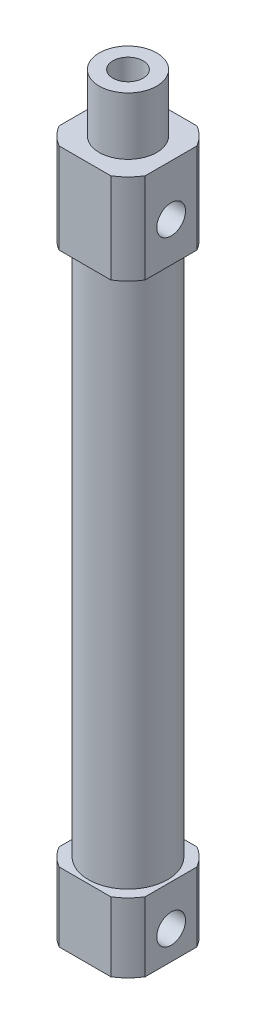
ISO-10303-21;
HEADER;
FILE_DESCRIPTION(('STEP AP214'),'2;1');
FILE_NAME('part.step','',(''),(''),'','','');
FILE_SCHEMA(('AUTOMOTIVE_DESIGN { 1 0 10303 214 1 1 1 1 }'));
ENDSEC;
DATA;
#1=APPLICATION_CONTEXT('core data for automotive mechanical design processes');
#2=APPLICATION_PROTOCOL_DEFINITION('international standard','automotive_design',2000,#1);
#3=PRODUCT_CONTEXT('',#1,'mechanical');
#4=PRODUCT('Part','Part','',(#3));
#5=PRODUCT_RELATED_PRODUCT_CATEGORY('part','',(#4));
#6=PRODUCT_DEFINITION_FORMATION('','',#4);
#7=PRODUCT_DEFINITION_CONTEXT('part definition',#1,'design');
#8=PRODUCT_DEFINITION('design','',#6,#7);
#9=PRODUCT_DEFINITION_SHAPE('','',#8);
#10=(LENGTH_UNIT() NAMED_UNIT(*) SI_UNIT(.MILLI.,.METRE.));
#11=(NAMED_UNIT(*) PLANE_ANGLE_UNIT() SI_UNIT($,.RADIAN.));
#12=(NAMED_UNIT(*) SI_UNIT($,.STERADIAN.) SOLID_ANGLE_UNIT());
#13=UNCERTAINTY_MEASURE_WITH_UNIT(LENGTH_MEASURE(1.E-05),#10,'distance_accuracy_value','');
#14=(GEOMETRIC_REPRESENTATION_CONTEXT(3) GLOBAL_UNCERTAINTY_ASSIGNED_CONTEXT((#13)) GLOBAL_UNIT_ASSIGNED_CONTEXT((#10,
#11,#12)) REPRESENTATION_CONTEXT('',''));
#15=CARTESIAN_POINT('',(0.,0.,0.));
#16=DIRECTION('',(0.,0.,1.));
#17=DIRECTION('',(1.,0.,0.));
#18=AXIS2_PLACEMENT_3D('',#15,#16,#17);
#19=CARTESIAN_POINT('',(6.,9.64,6.));
#20=DIRECTION('',(-1.,0.,0.));
#21=DIRECTION('',(0.,0.,1.));
#22=AXIS2_PLACEMENT_3D('',#19,#20,#21);
#23=PLANE('',#22);
#24=CARTESIAN_POINT('',(6.,4.,0.));
#25=DIRECTION('',(1.,0.,0.));
#26=DIRECTION('',(0.,0.,-1.));
#27=AXIS2_PLACEMENT_3D('',#24,#25,#26);
#28=CIRCLE('',#27,2.);
#29=CARTESIAN_POINT('',(6.,4.,-2.));
#30=VERTEX_POINT('',#29);
#31=EDGE_CURVE('E345',#30,#30,#28,.T.);
#32=ORIENTED_EDGE('',*,*,#31,.F.);
#33=EDGE_LOOP('',(#32));
#34=FACE_BOUND('',#33,.T.);
#35=DIRECTION('',(0.,1.,0.));
#36=VECTOR('',#35,1.);
#37=CARTESIAN_POINT('',(6.,-5.51000000000004,3.60555127546399));
#38=LINE('',#37,#36);
#39=CARTESIAN_POINT('',(6.,0.,3.60555127546399));
#40=VERTEX_POINT('',#39);
#41=CARTESIAN_POINT('',(6.,9.64,3.60555127546399));
#42=VERTEX_POINT('',#41);
#43=EDGE_CURVE('E280',#40,#42,#38,.T.);
#44=ORIENTED_EDGE('',*,*,#43,.F.);
#45=DIRECTION('',(0.,0.,-1.));
#46=VECTOR('',#45,1.);
#47=CARTESIAN_POINT('',(6.,0.,6.));
#48=LINE('',#47,#46);
#49=CARTESIAN_POINT('',(6.,0.,-3.60555127546399));
#50=VERTEX_POINT('',#49);
#51=EDGE_CURVE('E204',#40,#50,#48,.T.);
#52=ORIENTED_EDGE('',*,*,#51,.T.);
#53=DIRECTION('',(0.,1.,0.));
#54=VECTOR('',#53,1.);
#55=CARTESIAN_POINT('',(6.,-5.51000000000004,-3.60555127546399));
#56=LINE('',#55,#54);
#57=CARTESIAN_POINT('',(6.,9.64,-3.60555127546399));
#58=VERTEX_POINT('',#57);
#59=EDGE_CURVE('E286',#58,#50,#56,.F.);
#60=ORIENTED_EDGE('',*,*,#59,.F.);
#61=DIRECTION('',(0.,0.,-1.));
#62=VECTOR('',#61,1.);
#63=CARTESIAN_POINT('',(6.,9.64,6.));
#64=LINE('',#63,#62);
#65=EDGE_CURVE('E210',#42,#58,#64,.T.);
#66=ORIENTED_EDGE('',*,*,#65,.F.);
#67=EDGE_LOOP('',(#44,#52,#60,#66));
#68=FACE_BOUND('',#67,.T.);
#69=ADVANCED_FACE('F38',(#34,#68),#23,.F.);
#70=CARTESIAN_POINT('',(-6.,9.64,-6.));
#71=DIRECTION('',(0.,0.,1.));
#72=DIRECTION('',(1.,0.,0.));
#73=AXIS2_PLACEMENT_3D('',#70,#71,#72);
#74=PLANE('',#73);
#75=DIRECTION('',(0.,1.,0.));
#76=VECTOR('',#75,1.);
#77=CARTESIAN_POINT('',(3.60555127546399,-5.51000000000004,-6.));
#78=LINE('',#77,#76);
#79=CARTESIAN_POINT('',(3.60555127546399,0.,-6.));
#80=VERTEX_POINT('',#79);
#81=CARTESIAN_POINT('',(3.60555127546399,9.64,-6.));
#82=VERTEX_POINT('',#81);
#83=EDGE_CURVE('E284',#80,#82,#78,.T.);
#84=ORIENTED_EDGE('',*,*,#83,.F.);
#85=DIRECTION('',(-1.,0.,0.));
#86=VECTOR('',#85,1.);
#87=CARTESIAN_POINT('',(-6.,0.,-6.));
#88=LINE('',#87,#86);
#89=CARTESIAN_POINT('',(-3.60555127546399,0.,-6.));
#90=VERTEX_POINT('',#89);
#91=EDGE_CURVE('E224',#80,#90,#88,.T.);
#92=ORIENTED_EDGE('',*,*,#91,.T.);
#93=DIRECTION('',(0.,1.,0.));
#94=VECTOR('',#93,1.);
#95=CARTESIAN_POINT('',(-3.60555127546399,-5.51000000000004,-6.));
#96=LINE('',#95,#94);
#97=CARTESIAN_POINT('',(-3.60555127546399,9.64,-6.));
#98=VERTEX_POINT('',#97);
#99=EDGE_CURVE('E58',#98,#90,#96,.F.);
#100=ORIENTED_EDGE('',*,*,#99,.F.);
#101=DIRECTION('',(-1.,0.,0.));
#102=VECTOR('',#101,1.);
#103=CARTESIAN_POINT('',(-6.,9.64,-6.));
#104=LINE('',#103,#102);
#105=EDGE_CURVE('E213',#82,#98,#104,.T.);
#106=ORIENTED_EDGE('',*,*,#105,.F.);
#107=EDGE_LOOP('',(#84,#92,#100,#106));
#108=FACE_BOUND('',#107,.T.);
#109=ADVANCED_FACE('F321',(#108),#74,.F.);
#110=CARTESIAN_POINT('',(-6.,9.64,6.));
#111=DIRECTION('',(1.,0.,0.));
#112=DIRECTION('',(0.,0.,-1.));
#113=AXIS2_PLACEMENT_3D('',#110,#111,#112);
#114=PLANE('',#113);
#115=DIRECTION('',(0.,1.,0.));
#116=VECTOR('',#115,1.);
#117=CARTESIAN_POINT('',(-6.,-5.51000000000004,-3.60555127546399));
#118=LINE('',#117,#116);
#119=CARTESIAN_POINT('',(-6.,0.,-3.60555127546399));
#120=VERTEX_POINT('',#119);
#121=CARTESIAN_POINT('',(-6.,9.64,-3.60555127546399));
#122=VERTEX_POINT('',#121);
#123=EDGE_CURVE('E266',#120,#122,#118,.T.);
#124=ORIENTED_EDGE('',*,*,#123,.F.);
#125=DIRECTION('',(0.,0.,1.));
#126=VECTOR('',#125,1.);
#127=CARTESIAN_POINT('',(-6.,0.,6.));
#128=LINE('',#127,#126);
#129=CARTESIAN_POINT('',(-6.,0.,3.60555127546399));
#130=VERTEX_POINT('',#129);
#131=EDGE_CURVE('E227',#120,#130,#128,.T.);
#132=ORIENTED_EDGE('',*,*,#131,.T.);
#133=DIRECTION('',(0.,1.,0.));
#134=VECTOR('',#133,1.);
#135=CARTESIAN_POINT('',(-6.,-5.51000000000004,3.60555127546399));
#136=LINE('',#135,#134);
#137=CARTESIAN_POINT('',(-6.,9.64,3.60555127546399));
#138=VERTEX_POINT('',#137);
#139=EDGE_CURVE('E66',#138,#130,#136,.F.);
#140=ORIENTED_EDGE('',*,*,#139,.F.);
#141=DIRECTION('',(0.,0.,1.));
#142=VECTOR('',#141,1.);
#143=CARTESIAN_POINT('',(-6.,9.64,6.));
#144=LINE('',#143,#142);
#145=EDGE_CURVE('E217',#122,#138,#144,.T.);
#146=ORIENTED_EDGE('',*,*,#145,.F.);
#147=EDGE_LOOP('',(#124,#132,#140,#146));
#148=FACE_BOUND('',#147,.T.);
#149=ADVANCED_FACE('F312',(#148),#114,.F.);
#150=CARTESIAN_POINT('',(-6.,9.64,6.));
#151=DIRECTION('',(0.,0.,-1.));
#152=DIRECTION('',(-1.,0.,0.));
#153=AXIS2_PLACEMENT_3D('',#150,#151,#152);
#154=PLANE('',#153);
#155=DIRECTION('',(0.,1.,0.));
#156=VECTOR('',#155,1.);
#157=CARTESIAN_POINT('',(-3.60555127546399,-5.51000000000004,6.));
#158=LINE('',#157,#156);
#159=CARTESIAN_POINT('',(-3.60555127546399,0.,6.));
#160=VERTEX_POINT('',#159);
#161=CARTESIAN_POINT('',(-3.60555127546399,9.64,6.));
#162=VERTEX_POINT('',#161);
#163=EDGE_CURVE('E275',#160,#162,#158,.T.);
#164=ORIENTED_EDGE('',*,*,#163,.F.);
#165=DIRECTION('',(1.,0.,0.));
#166=VECTOR('',#165,1.);
#167=CARTESIAN_POINT('',(-6.,0.,6.));
#168=LINE('',#167,#166);
#169=CARTESIAN_POINT('',(3.60555127546399,0.,6.));
#170=VERTEX_POINT('',#169);
#171=EDGE_CURVE('E214',#160,#170,#168,.T.);
#172=ORIENTED_EDGE('',*,*,#171,.T.);
#173=DIRECTION('',(0.,1.,0.));
#174=VECTOR('',#173,1.);
#175=CARTESIAN_POINT('',(3.60555127546399,-5.51000000000004,6.));
#176=LINE('',#175,#174);
#177=CARTESIAN_POINT('',(3.60555127546399,9.64,6.));
#178=VERTEX_POINT('',#177);
#179=EDGE_CURVE('E278',#178,#170,#176,.F.);
#180=ORIENTED_EDGE('',*,*,#179,.F.);
#181=DIRECTION('',(1.,0.,0.));
#182=VECTOR('',#181,1.);
#183=CARTESIAN_POINT('',(-6.,9.64,6.));
#184=LINE('',#183,#182);
#185=EDGE_CURVE('E209',#162,#178,#184,.T.);
#186=ORIENTED_EDGE('',*,*,#185,.F.);
#187=EDGE_LOOP('',(#164,#172,#180,#186));
#188=FACE_BOUND('',#187,.T.);
#189=ADVANCED_FACE('F328',(#188),#154,.F.);
#190=CARTESIAN_POINT('',(0.,9.64,0.));
#191=DIRECTION('',(0.,-1.,0.));
#192=DIRECTION('',(0.,0.,-1.));
#193=AXIS2_PLACEMENT_3D('',#190,#191,#192);
#194=PLANE('',#193);
#195=CARTESIAN_POINT('',(0.,9.64,0.));
#196=DIRECTION('',(0.,1.,0.));
#197=DIRECTION('',(0.,0.,1.));
#198=AXIS2_PLACEMENT_3D('',#195,#196,#197);
#199=CIRCLE('',#198,5.5);
#200=CARTESIAN_POINT('',(0.,9.64,5.5));
#201=VERTEX_POINT('',#200);
#202=EDGE_CURVE('E205',#201,#201,#199,.T.);
#203=ORIENTED_EDGE('',*,*,#202,.F.);
#204=EDGE_LOOP('',(#203));
#205=FACE_BOUND('',#204,.T.);
#206=CARTESIAN_POINT('',(0.,9.64,0.));
#207=DIRECTION('',(0.,-1.,0.));
#208=DIRECTION('',(0.,0.,-1.));
#209=AXIS2_PLACEMENT_3D('',#206,#207,#208);
#210=CIRCLE('',#209,7.);
#211=EDGE_CURVE('E273',#82,#58,#210,.T.);
#212=ORIENTED_EDGE('',*,*,#211,.F.);
#213=ORIENTED_EDGE('',*,*,#105,.T.);
#214=EDGE_CURVE('E271',#122,#98,#210,.T.);
#215=ORIENTED_EDGE('',*,*,#214,.F.);
#216=ORIENTED_EDGE('',*,*,#145,.T.);
#217=EDGE_CURVE('E274',#162,#138,#210,.T.);
#218=ORIENTED_EDGE('',*,*,#217,.F.);
#219=ORIENTED_EDGE('',*,*,#185,.T.);
#220=EDGE_CURVE('E283',#42,#178,#210,.T.);
#221=ORIENTED_EDGE('',*,*,#220,.F.);
#222=ORIENTED_EDGE('',*,*,#65,.T.);
#223=EDGE_LOOP('',(#212,#213,#215,#216,#218,#219,#221,#222));
#224=FACE_BOUND('',#223,.T.);
#225=ADVANCED_FACE('F317',(#205,#224),#194,.F.);
#226=CARTESIAN_POINT('',(0.,0.,0.));
#227=DIRECTION('',(0.,-1.,0.));
#228=DIRECTION('',(0.,0.,-1.));
#229=AXIS2_PLACEMENT_3D('',#226,#227,#228);
#230=PLANE('',#229);
#231=ORIENTED_EDGE('',*,*,#91,.F.);
#232=CARTESIAN_POINT('',(0.,0.,0.));
#233=DIRECTION('',(0.,-1.,0.));
#234=DIRECTION('',(0.,0.,-1.));
#235=AXIS2_PLACEMENT_3D('',#232,#233,#234);
#236=CIRCLE('',#235,7.);
#237=EDGE_CURVE('E267',#80,#50,#236,.T.);
#238=ORIENTED_EDGE('',*,*,#237,.T.);
#239=ORIENTED_EDGE('',*,*,#51,.F.);
#240=EDGE_CURVE('E281',#40,#170,#236,.T.);
#241=ORIENTED_EDGE('',*,*,#240,.T.);
#242=ORIENTED_EDGE('',*,*,#171,.F.);
#243=EDGE_CURVE('E268',#160,#130,#236,.T.);
#244=ORIENTED_EDGE('',*,*,#243,.T.);
#245=ORIENTED_EDGE('',*,*,#131,.F.);
#246=EDGE_CURVE('E177',#120,#90,#236,.T.);
#247=ORIENTED_EDGE('',*,*,#246,.T.);
#248=EDGE_LOOP('',(#231,#238,#239,#241,#242,#244,#245,#247));
#249=FACE_BOUND('',#248,.T.);
#250=ADVANCED_FACE('F308',(#249),#230,.T.);
#251=CARTESIAN_POINT('',(6.,96.49,-6.));
#252=DIRECTION('',(0.,0.,1.));
#253=DIRECTION('',(1.,0.,0.));
#254=AXIS2_PLACEMENT_3D('',#251,#252,#253);
#255=PLANE('',#254);
#256=DIRECTION('',(0.,1.,0.));
#257=VECTOR('',#256,1.);
#258=CARTESIAN_POINT('',(3.60555127546399,-5.51000000000004,-6.));
#259=LINE('',#258,#257);
#260=CARTESIAN_POINT('',(3.60555127546399,83.94,-6.));
#261=VERTEX_POINT('',#260);
#262=CARTESIAN_POINT('',(3.60555127546399,96.49,-6.));
#263=VERTEX_POINT('',#262);
#264=EDGE_CURVE('E250',#261,#263,#259,.T.);
#265=ORIENTED_EDGE('',*,*,#264,.F.);
#266=DIRECTION('',(-1.,0.,0.));
#267=VECTOR('',#266,1.);
#268=CARTESIAN_POINT('',(6.,83.94,-6.));
#269=LINE('',#268,#267);
#270=CARTESIAN_POINT('',(-3.60555127546399,83.94,-6.));
#271=VERTEX_POINT('',#270);
#272=EDGE_CURVE('E191',#261,#271,#269,.T.);
#273=ORIENTED_EDGE('',*,*,#272,.T.);
#274=DIRECTION('',(0.,1.,0.));
#275=VECTOR('',#274,1.);
#276=CARTESIAN_POINT('',(-3.60555127546399,-5.51000000000004,-6.));
#277=LINE('',#276,#275);
#278=CARTESIAN_POINT('',(-3.60555127546399,96.49,-6.));
#279=VERTEX_POINT('',#278);
#280=EDGE_CURVE('E252',#279,#271,#277,.F.);
#281=ORIENTED_EDGE('',*,*,#280,.F.);
#282=DIRECTION('',(-1.,0.,0.));
#283=VECTOR('',#282,1.);
#284=CARTESIAN_POINT('',(6.,96.49,-6.));
#285=LINE('',#284,#283);
#286=EDGE_CURVE('E187',#263,#279,#285,.T.);
#287=ORIENTED_EDGE('',*,*,#286,.F.);
#288=EDGE_LOOP('',(#265,#273,#281,#287));
#289=FACE_BOUND('',#288,.T.);
#290=ADVANCED_FACE('F249',(#289),#255,.F.);
#291=CARTESIAN_POINT('',(-6.,96.49,-6.));
#292=DIRECTION('',(1.,0.,0.));
#293=DIRECTION('',(0.,0.,-1.));
#294=AXIS2_PLACEMENT_3D('',#291,#292,#293);
#295=PLANE('',#294);
#296=DIRECTION('',(0.,1.,0.));
#297=VECTOR('',#296,1.);
#298=CARTESIAN_POINT('',(-6.,-5.51000000000004,-3.60555127546399));
#299=LINE('',#298,#297);
#300=CARTESIAN_POINT('',(-6.,83.94,-3.60555127546399));
#301=VERTEX_POINT('',#300);
#302=CARTESIAN_POINT('',(-6.,96.49,-3.60555127546399));
#303=VERTEX_POINT('',#302);
#304=EDGE_CURVE('E256',#301,#303,#299,.T.);
#305=ORIENTED_EDGE('',*,*,#304,.F.);
#306=DIRECTION('',(0.,0.,1.));
#307=VECTOR('',#306,1.);
#308=CARTESIAN_POINT('',(-6.,83.94,-6.));
#309=LINE('',#308,#307);
#310=CARTESIAN_POINT('',(-6.,83.94,3.60555127546399));
#311=VERTEX_POINT('',#310);
#312=EDGE_CURVE('E194',#301,#311,#309,.T.);
#313=ORIENTED_EDGE('',*,*,#312,.T.);
#314=DIRECTION('',(0.,1.,0.));
#315=VECTOR('',#314,1.);
#316=CARTESIAN_POINT('',(-6.,-5.51000000000004,3.60555127546399));
#317=LINE('',#316,#315);
#318=CARTESIAN_POINT('',(-6.,96.49,3.60555127546399));
#319=VERTEX_POINT('',#318);
#320=EDGE_CURVE('E259',#319,#311,#317,.F.);
#321=ORIENTED_EDGE('',*,*,#320,.F.);
#322=DIRECTION('',(0.,0.,1.));
#323=VECTOR('',#322,1.);
#324=CARTESIAN_POINT('',(-6.,96.49,-6.));
#325=LINE('',#324,#323);
#326=EDGE_CURVE('E183',#303,#319,#325,.T.);
#327=ORIENTED_EDGE('',*,*,#326,.F.);
#328=EDGE_LOOP('',(#305,#313,#321,#327));
#329=FACE_BOUND('',#328,.T.);
#330=ADVANCED_FACE('F362',(#329),#295,.F.);
#331=CARTESIAN_POINT('',(-6.,96.49,6.));
#332=DIRECTION('',(0.,0.,-1.));
#333=DIRECTION('',(-1.,0.,0.));
#334=AXIS2_PLACEMENT_3D('',#331,#332,#333);
#335=PLANE('',#334);
#336=DIRECTION('',(0.,1.,0.));
#337=VECTOR('',#336,1.);
#338=CARTESIAN_POINT('',(-3.60555127546399,-5.51000000000004,6.));
#339=LINE('',#338,#337);
#340=CARTESIAN_POINT('',(-3.60555127546399,83.94,6.));
#341=VERTEX_POINT('',#340);
#342=CARTESIAN_POINT('',(-3.60555127546399,96.49,6.));
#343=VERTEX_POINT('',#342);
#344=EDGE_CURVE('E165',#341,#343,#339,.T.);
#345=ORIENTED_EDGE('',*,*,#344,.F.);
#346=DIRECTION('',(1.,0.,0.));
#347=VECTOR('',#346,1.);
#348=CARTESIAN_POINT('',(-6.,83.94,6.));
#349=LINE('',#348,#347);
#350=CARTESIAN_POINT('',(3.60555127546399,83.94,6.));
#351=VERTEX_POINT('',#350);
#352=EDGE_CURVE('E176',#341,#351,#349,.T.);
#353=ORIENTED_EDGE('',*,*,#352,.T.);
#354=DIRECTION('',(0.,1.,0.));
#355=VECTOR('',#354,1.);
#356=CARTESIAN_POINT('',(3.60555127546399,-5.51000000000004,6.));
#357=LINE('',#356,#355);
#358=CARTESIAN_POINT('',(3.60555127546399,96.49,6.));
#359=VERTEX_POINT('',#358);
#360=EDGE_CURVE('E157',#359,#351,#357,.F.);
#361=ORIENTED_EDGE('',*,*,#360,.F.);
#362=DIRECTION('',(1.,0.,0.));
#363=VECTOR('',#362,1.);
#364=CARTESIAN_POINT('',(-6.,96.49,6.));
#365=LINE('',#364,#363);
#366=EDGE_CURVE('E174',#343,#359,#365,.T.);
#367=ORIENTED_EDGE('',*,*,#366,.F.);
#368=EDGE_LOOP('',(#345,#353,#361,#367));
#369=FACE_BOUND('',#368,.T.);
#370=ADVANCED_FACE('F173',(#369),#335,.F.);
#371=CARTESIAN_POINT('',(6.,96.49,6.));
#372=DIRECTION('',(-1.,0.,0.));
#373=DIRECTION('',(0.,0.,1.));
#374=AXIS2_PLACEMENT_3D('',#371,#372,#373);
#375=PLANE('',#374);
#376=CARTESIAN_POINT('',(6.,89.44,0.));
#377=DIRECTION('',(1.,0.,0.));
#378=DIRECTION('',(0.,0.,-1.));
#379=AXIS2_PLACEMENT_3D('',#376,#377,#378);
#380=CIRCLE('',#379,2.);
#381=CARTESIAN_POINT('',(6.,89.44,-2.));
#382=VERTEX_POINT('',#381);
#383=EDGE_CURVE('E348',#382,#382,#380,.T.);
#384=ORIENTED_EDGE('',*,*,#383,.F.);
#385=EDGE_LOOP('',(#384));
#386=FACE_BOUND('',#385,.T.);
#387=DIRECTION('',(0.,1.,0.));
#388=VECTOR('',#387,1.);
#389=CARTESIAN_POINT('',(6.,-5.51000000000004,3.60555127546399));
#390=LINE('',#389,#388);
#391=CARTESIAN_POINT('',(6.,83.94,3.60555127546399));
#392=VERTEX_POINT('',#391);
#393=CARTESIAN_POINT('',(6.,96.49,3.60555127546399));
#394=VERTEX_POINT('',#393);
#395=EDGE_CURVE('E160',#392,#394,#390,.T.);
#396=ORIENTED_EDGE('',*,*,#395,.F.);
#397=DIRECTION('',(0.,0.,-1.));
#398=VECTOR('',#397,1.);
#399=CARTESIAN_POINT('',(6.,83.94,6.));
#400=LINE('',#399,#398);
#401=CARTESIAN_POINT('',(6.,83.94,-3.60555127546399));
#402=VERTEX_POINT('',#401);
#403=EDGE_CURVE('E199',#392,#402,#400,.T.);
#404=ORIENTED_EDGE('',*,*,#403,.T.);
#405=DIRECTION('',(0.,1.,0.));
#406=VECTOR('',#405,1.);
#407=CARTESIAN_POINT('',(6.,-5.51000000000004,-3.60555127546399));
#408=LINE('',#407,#406);
#409=CARTESIAN_POINT('',(6.,96.49,-3.60555127546399));
#410=VERTEX_POINT('',#409);
#411=EDGE_CURVE('E255',#410,#402,#408,.F.);
#412=ORIENTED_EDGE('',*,*,#411,.F.);
#413=DIRECTION('',(0.,0.,-1.));
#414=VECTOR('',#413,1.);
#415=CARTESIAN_POINT('',(6.,96.49,6.));
#416=LINE('',#415,#414);
#417=EDGE_CURVE('E182',#394,#410,#416,.T.);
#418=ORIENTED_EDGE('',*,*,#417,.F.);
#419=EDGE_LOOP('',(#396,#404,#412,#418));
#420=FACE_BOUND('',#419,.T.);
#421=ADVANCED_FACE('F369',(#386,#420),#375,.F.);
#422=CARTESIAN_POINT('',(0.,96.49,0.));
#423=DIRECTION('',(0.,1.,0.));
#424=DIRECTION('',(0.,0.,1.));
#425=AXIS2_PLACEMENT_3D('',#422,#423,#424);
#426=PLANE('',#425);
#427=CARTESIAN_POINT('',(0.,96.49,0.));
#428=DIRECTION('',(0.,1.,0.));
#429=DIRECTION('',(0.,0.,1.));
#430=AXIS2_PLACEMENT_3D('',#427,#428,#429);
#431=CIRCLE('',#430,4.);
#432=CARTESIAN_POINT('',(0.,96.49,4.));
#433=VERTEX_POINT('',#432);
#434=EDGE_CURVE('E208',#433,#433,#431,.T.);
#435=ORIENTED_EDGE('',*,*,#434,.F.);
#436=EDGE_LOOP('',(#435));
#437=FACE_BOUND('',#436,.T.);
#438=ORIENTED_EDGE('',*,*,#366,.T.);
#439=CARTESIAN_POINT('',(0.,96.49,0.));
#440=DIRECTION('',(0.,1.,0.));
#441=DIRECTION('',(0.,0.,1.));
#442=AXIS2_PLACEMENT_3D('',#439,#440,#441);
#443=CIRCLE('',#442,7.);
#444=EDGE_CURVE('E154',#359,#394,#443,.T.);
#445=ORIENTED_EDGE('',*,*,#444,.T.);
#446=ORIENTED_EDGE('',*,*,#417,.T.);
#447=EDGE_CURVE('E166',#410,#263,#443,.T.);
#448=ORIENTED_EDGE('',*,*,#447,.T.);
#449=ORIENTED_EDGE('',*,*,#286,.T.);
#450=EDGE_CURVE('E244',#279,#303,#443,.T.);
#451=ORIENTED_EDGE('',*,*,#450,.T.);
#452=ORIENTED_EDGE('',*,*,#326,.T.);
#453=EDGE_CURVE('E168',#319,#343,#443,.T.);
#454=ORIENTED_EDGE('',*,*,#453,.T.);
#455=EDGE_LOOP('',(#438,#445,#446,#448,#449,#451,#452,#454));
#456=FACE_BOUND('',#455,.T.);
#457=ADVANCED_FACE('F180',(#437,#456),#426,.T.);
#458=CARTESIAN_POINT('',(0.,83.94,0.));
#459=DIRECTION('',(0.,1.,0.));
#460=DIRECTION('',(0.,0.,1.));
#461=AXIS2_PLACEMENT_3D('',#458,#459,#460);
#462=PLANE('',#461);
#463=CARTESIAN_POINT('',(0.,83.94,0.));
#464=DIRECTION('',(0.,1.,0.));
#465=DIRECTION('',(0.,0.,1.));
#466=AXIS2_PLACEMENT_3D('',#463,#464,#465);
#467=CIRCLE('',#466,5.5);
#468=CARTESIAN_POINT('',(0.,83.94,5.5));
#469=VERTEX_POINT('',#468);
#470=EDGE_CURVE('E185',#469,#469,#467,.T.);
#471=ORIENTED_EDGE('',*,*,#470,.T.);
#472=EDGE_LOOP('',(#471));
#473=FACE_BOUND('',#472,.T.);
#474=CARTESIAN_POINT('',(0.,83.94,0.));
#475=DIRECTION('',(0.,1.,0.));
#476=DIRECTION('',(0.,0.,1.));
#477=AXIS2_PLACEMENT_3D('',#474,#475,#476);
#478=CIRCLE('',#477,7.);
#479=EDGE_CURVE('E11',#351,#392,#478,.T.);
#480=ORIENTED_EDGE('',*,*,#479,.F.);
#481=ORIENTED_EDGE('',*,*,#352,.F.);
#482=EDGE_CURVE('E51',#311,#341,#478,.T.);
#483=ORIENTED_EDGE('',*,*,#482,.F.);
#484=ORIENTED_EDGE('',*,*,#312,.F.);
#485=EDGE_CURVE('E231',#271,#301,#478,.T.);
#486=ORIENTED_EDGE('',*,*,#485,.F.);
#487=ORIENTED_EDGE('',*,*,#272,.F.);
#488=EDGE_CURVE('E50',#402,#261,#478,.T.);
#489=ORIENTED_EDGE('',*,*,#488,.F.);
#490=ORIENTED_EDGE('',*,*,#403,.F.);
#491=EDGE_LOOP('',(#480,#481,#483,#484,#486,#487,#489,#490));
#492=FACE_BOUND('',#491,.T.);
#493=ADVANCED_FACE('F360',(#473,#492),#462,.F.);
#494=CARTESIAN_POINT('',(0.,83.94,0.));
#495=DIRECTION('',(0.,-1.,0.));
#496=DIRECTION('',(0.,0.,-1.));
#497=AXIS2_PLACEMENT_3D('',#494,#495,#496);
#498=CYLINDRICAL_SURFACE('',#497,5.5);
#499=ORIENTED_EDGE('',*,*,#470,.F.);
#500=EDGE_LOOP('',(#499));
#501=FACE_BOUND('',#500,.T.);
#502=ORIENTED_EDGE('',*,*,#202,.T.);
#503=EDGE_LOOP('',(#502));
#504=FACE_BOUND('',#503,.T.);
#505=ADVANCED_FACE('F414',(#501,#504),#498,.T.);
#506=CARTESIAN_POINT('',(0.,104.49,0.));
#507=DIRECTION('',(0.,-1.,0.));
#508=DIRECTION('',(0.,0.,-1.));
#509=AXIS2_PLACEMENT_3D('',#506,#507,#508);
#510=CYLINDRICAL_SURFACE('',#509,4.);
#511=CARTESIAN_POINT('',(0.,104.49,0.));
#512=DIRECTION('',(0.,1.,0.));
#513=DIRECTION('',(0.,0.,1.));
#514=AXIS2_PLACEMENT_3D('',#511,#512,#513);
#515=CIRCLE('',#514,4.);
#516=CARTESIAN_POINT('',(0.,104.49,4.));
#517=VERTEX_POINT('',#516);
#518=EDGE_CURVE('E195',#517,#517,#515,.T.);
#519=ORIENTED_EDGE('',*,*,#518,.F.);
#520=EDGE_LOOP('',(#519));
#521=FACE_BOUND('',#520,.T.);
#522=ORIENTED_EDGE('',*,*,#434,.T.);
#523=EDGE_LOOP('',(#522));
#524=FACE_BOUND('',#523,.T.);
#525=ADVANCED_FACE('F409',(#521,#524),#510,.T.);
#526=CARTESIAN_POINT('',(0.,104.49,0.));
#527=DIRECTION('',(0.,1.,0.));
#528=DIRECTION('',(0.,0.,1.));
#529=AXIS2_PLACEMENT_3D('',#526,#527,#528);
#530=PLANE('',#529);
#531=CARTESIAN_POINT('',(0.,104.49,0.));
#532=DIRECTION('',(0.,1.,0.));
#533=DIRECTION('',(0.,0.,1.));
#534=AXIS2_PLACEMENT_3D('',#531,#532,#533);
#535=CIRCLE('',#534,2.1);
#536=CARTESIAN_POINT('',(0.,104.49,2.1));
#537=VERTEX_POINT('',#536);
#538=EDGE_CURVE('E290',#537,#537,#535,.T.);
#539=ORIENTED_EDGE('',*,*,#538,.F.);
#540=EDGE_LOOP('',(#539));
#541=FACE_BOUND('',#540,.T.);
#542=ORIENTED_EDGE('',*,*,#518,.T.);
#543=EDGE_LOOP('',(#542));
#544=FACE_BOUND('',#543,.T.);
#545=ADVANCED_FACE('F413',(#541,#544),#530,.T.);
#546=CARTESIAN_POINT('',(0.,10.49,0.));
#547=DIRECTION('',(0.,1.,0.));
#548=DIRECTION('',(0.,0.,1.));
#549=AXIS2_PLACEMENT_3D('',#546,#547,#548);
#550=CYLINDRICAL_SURFACE('',#549,2.1);
#551=CARTESIAN_POINT('',(0.640312423743281,89.44,-2.));
#552=CARTESIAN_POINT('',(0.640301103879965,89.4805135405403,-2.00000218248593));
#553=CARTESIAN_POINT('',(0.644240368489197,89.5210164891081,-1.99875388919009));
#554=CARTESIAN_POINT('',(0.658995696755951,89.6006947863936,-1.99393639871391));
#555=CARTESIAN_POINT('',(0.66984156738944,89.639863601628,-1.9903571402145));
#556=CARTESIAN_POINT('',(0.704558367046291,89.7396212345429,-1.97840645597848));
#557=CARTESIAN_POINT('',(0.732337819193503,89.7985942785551,-1.96844198832273));
#558=CARTESIAN_POINT('',(0.794185967237124,89.9122335232413,-1.94432241497964));
#559=CARTESIAN_POINT('',(0.828281517341357,89.9668798559699,-1.93014925387458));
#560=CARTESIAN_POINT('',(0.905672657312108,90.0821544168318,-1.89521984599805));
#561=CARTESIAN_POINT('',(0.949538629947992,90.1421781388746,-1.87374841388452));
#562=CARTESIAN_POINT('',(1.03888839714056,90.258953677988,-1.82573235882892));
#563=CARTESIAN_POINT('',(1.08437384277474,90.3157019917637,-1.79918243031374));
#564=CARTESIAN_POINT('',(1.17554489115081,90.426348674859,-1.74098244096229));
#565=CARTESIAN_POINT('',(1.22123046911578,90.4802473867399,-1.70933299501805));
#566=CARTESIAN_POINT('',(1.31182519442526,90.5852436341215,-1.6408355086838));
#567=CARTESIAN_POINT('',(1.3567347563803,90.6363426992271,-1.60399034713918));
#568=CARTESIAN_POINT('',(1.4757118824881,90.7701201240369,-1.49745107820672));
#569=CARTESIAN_POINT('',(1.54839342828495,90.8501133151573,-1.42270113355719));
#570=CARTESIAN_POINT('',(1.68562462111273,90.9995453921697,-1.25706142056087));
#571=CARTESIAN_POINT('',(1.75019131629675,91.0690064701809,-1.16620648902389));
#572=CARTESIAN_POINT('',(1.85240173194541,91.1782934979385,-0.992994393703209));
#573=CARTESIAN_POINT('',(1.89274209921358,91.2211881681286,-0.914182094728266));
#574=CARTESIAN_POINT('',(1.96433542876839,91.2970871172639,-0.748031177854297));
#575=CARTESIAN_POINT('',(1.99559267346698,91.3300960572512,-0.660696603973641));
#576=CARTESIAN_POINT('',(2.04701946285322,91.3843156176699,-0.478288747198167));
#577=CARTESIAN_POINT('',(2.06708342361838,91.4054139088882,-0.383151171118985));
#578=CARTESIAN_POINT('',(2.09376452427496,91.4334565919427,-0.188989045701218));
#579=CARTESIAN_POINT('',(2.10039589378564,91.4404159616621,-0.0899687230033925));
#580=CARTESIAN_POINT('',(2.09962572477513,91.4396067771398,0.0936226695887095));
#581=CARTESIAN_POINT('',(2.09410703961843,91.4338143384527,0.178221584237619));
#582=CARTESIAN_POINT('',(2.07320090559364,91.4118451918264,0.34479322430029));
#583=CARTESIAN_POINT('',(2.0578126214706,91.3956676050016,0.426765726826712));
#584=CARTESIAN_POINT('',(2.01850212682888,91.3542602932605,0.584994585658025));
#585=CARTESIAN_POINT('',(1.9946924051082,91.3291498637952,0.661310974813997));
#586=CARTESIAN_POINT('',(1.93986493877654,91.2711648397414,0.808130590388775));
#587=CARTESIAN_POINT('',(1.90884500648644,91.2382878886316,0.878632043660595));
#588=CARTESIAN_POINT('',(1.82488502046192,91.1489583129724,1.04504372010186));
#589=CARTESIAN_POINT('',(1.76851815263698,91.0887112855784,1.13719159663348));
#590=CARTESIAN_POINT('',(1.64692462855833,90.9575561472972,1.30713875002542));
#591=CARTESIAN_POINT('',(1.58167192027139,90.8866166195923,1.38489418678122));
#592=CARTESIAN_POINT('',(1.46823805241842,90.7614270031387,1.50285661811941));
#593=CARTESIAN_POINT('',(1.42155297615782,90.7094221508889,1.54697445511384));
#594=CARTESIAN_POINT('',(1.32658910760211,90.6020969050282,1.62914189757597));
#595=CARTESIAN_POINT('',(1.27830938494541,90.5467745599829,1.66718788228552));
#596=CARTESIAN_POINT('',(1.18123152344557,90.4330686426475,1.73731773912362));
#597=CARTESIAN_POINT('',(1.13243411859897,90.3746890360435,1.76940910106424));
#598=CARTESIAN_POINT('',(1.03553116919406,90.2546175279488,1.82780183722992));
#599=CARTESIAN_POINT('',(0.987425085799496,90.1929284058864,1.85410797821869));
#600=CARTESIAN_POINT('',(0.904725592017361,90.0800315357267,1.8955463171084));
#601=CARTESIAN_POINT('',(0.869566620469222,90.029671317432,1.91185718977512));
#602=CARTESIAN_POINT('',(0.802666318332807,89.9256718742481,1.94088689907432));
#603=CARTESIAN_POINT('',(0.770923080380972,89.8720345058488,1.95360774690343));
#604=CARTESIAN_POINT('',(0.722598881613443,89.7766083321534,1.97188136086326));
#605=CARTESIAN_POINT('',(0.704293197590943,89.735910443046,1.97844286343864));
#606=CARTESIAN_POINT('',(0.67341397613023,89.6521024963439,1.98916635718693));
#607=CARTESIAN_POINT('',(0.660822308108355,89.6090005626147,1.99333594917921));
#608=CARTESIAN_POINT('',(0.645666244037747,89.5298264290003,1.99829142951457));
#609=CARTESIAN_POINT('',(0.641592395687491,89.4940882056313,1.99958991053526));
#610=CARTESIAN_POINT('',(0.639553543510186,89.4224483775733,2.00024322114737));
#611=CARTESIAN_POINT('',(0.641581845630946,89.3865469950244,1.999600180583));
#612=CARTESIAN_POINT('',(0.652435956602071,89.3075841909179,1.99608729645362));
#613=CARTESIAN_POINT('',(0.662702145730123,89.2647503034733,1.99274449057978));
#614=CARTESIAN_POINT('',(0.689460698692913,89.181262868494,1.98364276273663));
#615=CARTESIAN_POINT('',(0.705983228711362,89.1406209925067,1.9778721192481));
#616=CARTESIAN_POINT('',(0.747531138527059,89.0517880881681,1.96259974290869));
#617=CARTESIAN_POINT('',(0.773649002949055,89.0042236736775,1.95252767507841));
#618=CARTESIAN_POINT('',(0.829253117326828,88.9117767497731,1.92957289283833));
#619=CARTESIAN_POINT('',(0.858745967622316,88.8668997663102,1.91668462454952));
#620=CARTESIAN_POINT('',(0.919683683207447,88.7790775403463,1.88820538872617));
#621=CARTESIAN_POINT('',(0.951136822522114,88.7361420204089,1.87260238622608));
#622=CARTESIAN_POINT('',(1.01497192527373,88.6520189802409,1.83878770463234));
#623=CARTESIAN_POINT('',(1.04735418126212,88.610832020931,1.8205751965107));
#624=CARTESIAN_POINT('',(1.12873725939338,88.5097579201476,1.77177530720817));
#625=CARTESIAN_POINT('',(1.17795160069664,88.4508177126029,1.73955369056368));
#626=CARTESIAN_POINT('',(1.27580482481365,88.3361174128712,1.66912339016895));
#627=CARTESIAN_POINT('',(1.32444332769111,88.2803593366449,1.63091096728339));
#628=CARTESIAN_POINT('',(1.46763146117106,88.1184406608425,1.50727436788941));
#629=CARTESIAN_POINT('',(1.55998207783167,88.0170067575532,1.41255150667061));
#630=CARTESIAN_POINT('',(1.70138053719948,87.8635454811317,1.23428148494945));
#631=CARTESIAN_POINT('',(1.75439092205154,87.8065307915555,1.15811289896738));
#632=CARTESIAN_POINT('',(1.85200955084452,87.7021008878609,0.994530989113269));
#633=CARTESIAN_POINT('',(1.89662708482411,87.6546750554394,0.907130280671326));
#634=CARTESIAN_POINT('',(1.96784814185255,87.5792070348614,0.737900625667113));
#635=CARTESIAN_POINT('',(1.99622893290792,87.5492352598721,0.657688280975955));
#636=CARTESIAN_POINT('',(2.04349563503842,87.4993975450956,0.491496403619512));
#637=CARTESIAN_POINT('',(2.06238784568399,87.4795249002835,0.405520740380041));
#638=CARTESIAN_POINT('',(2.0893288311223,87.4512028420869,0.229497998935145));
#639=CARTESIAN_POINT('',(2.09731626572432,87.4428180478036,0.139430810116922));
#640=CARTESIAN_POINT('',(2.10153670707651,87.4383863476311,-0.0412793142869946));
#641=CARTESIAN_POINT('',(2.09777238175691,87.4423366413822,-0.131922114532551));
#642=CARTESIAN_POINT('',(2.07972143963622,87.4613013499802,-0.302370915965056));
#643=CARTESIAN_POINT('',(2.06643462418463,87.4752645468032,-0.382406759663844));
#644=CARTESIAN_POINT('',(2.03138001788502,87.5121675551945,-0.538416329260483));
#645=CARTESIAN_POINT('',(2.00961065795638,87.5351090275461,-0.614389300659438));
#646=CARTESIAN_POINT('',(1.95714840326391,87.5905364580558,-0.765773503759757));
#647=CARTESIAN_POINT('',(1.92596084150094,87.6235530019533,-0.840815774416809));
#648=CARTESIAN_POINT('',(1.85694844292251,87.6968960915925,-0.983902658040583));
#649=CARTESIAN_POINT('',(1.81912008301772,87.7372265178866,-1.05194352606532));
#650=CARTESIAN_POINT('',(1.71556656798414,87.8482188176836,-1.21693591368294));
#651=CARTESIAN_POINT('',(1.64610854543656,87.9231916407969,-1.3086537991073));
#652=CARTESIAN_POINT('',(1.49917561284265,88.0840374592143,-1.47472323553421));
#653=CARTESIAN_POINT('',(1.42167733294906,88.1699424037016,-1.5490219933501));
#654=CARTESIAN_POINT('',(1.30160266910827,88.3065775088251,-1.64883007762909));
#655=CARTESIAN_POINT('',(1.26035835672665,88.3541130123094,-1.68050238722699));
#656=CARTESIAN_POINT('',(1.17750792509332,88.4514733347832,-1.73955726114965));
#657=CARTESIAN_POINT('',(1.13590189482816,88.5012976029488,-1.76694085069342));
#658=CARTESIAN_POINT('',(1.0531959389967,88.6032730629478,-1.81744901167468));
#659=CARTESIAN_POINT('',(1.01209519069704,88.6554195714475,-1.84058171219415));
#660=CARTESIAN_POINT('',(0.931503370930139,88.7625355108859,-1.88264600716682));
#661=CARTESIAN_POINT('',(0.892010902429256,88.8175023938541,-1.90158131409742));
#662=CARTESIAN_POINT('',(0.824373061257031,88.9196720060498,-1.93170642773729));
#663=CARTESIAN_POINT('',(0.795551449047776,88.9661864245489,-1.94368826312019));
#664=CARTESIAN_POINT('',(0.742265667338258,89.0624138550119,-1.96465134803525));
#665=CARTESIAN_POINT('',(0.71780164025981,89.1121269714487,-1.97363249950248));
#666=CARTESIAN_POINT('',(0.679989670116044,89.2076271257028,-1.98694681120652));
#667=CARTESIAN_POINT('',(0.665521584028419,89.2528752187391,-1.99177673710043));
#668=CARTESIAN_POINT('',(0.64571870487468,89.3454304522323,-1.99829202239708));
#669=CARTESIAN_POINT('',(0.640325633537616,89.3927224381307,-1.99999745313266));
#670=CARTESIAN_POINT('',(0.640312423743281,89.44,-2.));
#671=B_SPLINE_CURVE_WITH_KNOTS('',3,(#551,#552,#553,#554,#555,#556,#557,#558,#559,#560,#561,
#562,#563,#564,#565,#566,#567,#568,#569,#570,#571,#572,#573,#574,#575,#576,#577,#578,#579,#580,
#581,#582,#583,#584,#585,#586,#587,#588,#589,#590,#591,#592,#593,#594,#595,#596,#597,#598,#599,
#600,#601,#602,#603,#604,#605,#606,#607,#608,#609,#610,#611,#612,#613,#614,#615,#616,#617,#618,
#619,#620,#621,#622,#623,#624,#625,#626,#627,#628,#629,#630,#631,#632,#633,#634,#635,#636,#637,
#638,#639,#640,#641,#642,#643,#644,#645,#646,#647,#648,#649,#650,#651,#652,#653,#654,#655,#656,
#657,#658,#659,#660,#661,#662,#663,#664,#665,#666,#667,#668,#669,#670),.UNSPECIFIED.,.T.,.F.,(4,
2,2,2,2,2,2,2,2,2,2,2,2,2,2,2,2,2,2,2,2,2,2,2,2,2,2,2,2,2,2,2,2,2,2,2,2,2,2,2,2,2,2,2,2,2,2,2,2,
2,2,2,2,2,2,2,2,2,2,4),(0.,0.121350697626202,0.243228693359232,0.439945116151423,
0.637517959766808,0.869329891525846,1.10138533623043,1.33341282095414,1.56531224523529,
1.95809120550978,2.3500306863991,2.64408221643262,2.93799488447619,3.23463501780733,
3.53096074506251,3.78462479016506,4.03831030545221,4.28872781168535,4.53922139751628,
4.90824378973125,5.27837238173736,5.52602222101314,5.77381919108978,6.02130233377782,
6.26858079099347,6.45905586432903,6.64942401730792,6.78442668086936,6.91899793301802,
7.02644745154133,7.1337791410597,7.26550914702807,7.39788257461133,7.56307585182604,
7.72859789816703,7.89487335813277,8.06120176066402,8.31069647383158,8.56034753256018,
9.05705617032484,9.38276930497944,9.70811975878981,9.97765251803833,10.2470060942634,
10.5178686472124,10.7886697123635,11.0345597529387,11.2804952992693,11.5426845920325,
11.8050134046678,12.2147220269778,12.6256567730532,12.8368840540202,13.0480607637564,
13.2588293340757,13.4694107349965,13.6372541898195,13.8051031293742,13.9476330287598,
14.0892440812223),.UNSPECIFIED.);
#672=CARTESIAN_POINT('',(0.640312423743281,89.44,-2.));
#673=VERTEX_POINT('',#672);
#674=EDGE_CURVE('E41',#673,#673,#671,.T.);
#675=ORIENTED_EDGE('',*,*,#674,.T.);
#676=EDGE_LOOP('',(#675));
#677=FACE_BOUND('',#676,.T.);
#678=CARTESIAN_POINT('',(0.,10.49,0.));
#679=DIRECTION('',(0.,1.,0.));
#680=DIRECTION('',(0.,0.,1.));
#681=AXIS2_PLACEMENT_3D('',#678,#679,#680);
#682=CIRCLE('',#681,2.1);
#683=CARTESIAN_POINT('',(0.,10.49,2.1));
#684=VERTEX_POINT('',#683);
#685=EDGE_CURVE('E288',#684,#684,#682,.T.);
#686=ORIENTED_EDGE('',*,*,#685,.F.);
#687=EDGE_LOOP('',(#686));
#688=FACE_BOUND('',#687,.T.);
#689=ORIENTED_EDGE('',*,*,#538,.T.);
#690=EDGE_LOOP('',(#689));
#691=FACE_BOUND('',#690,.T.);
#692=ADVANCED_FACE('F374',(#677,#688,#691),#550,.F.);
#693=CARTESIAN_POINT('',(0.,10.49,0.));
#694=DIRECTION('',(0.,1.,0.));
#695=DIRECTION('',(0.,0.,1.));
#696=AXIS2_PLACEMENT_3D('',#693,#694,#695);
#697=PLANE('',#696);
#698=ORIENTED_EDGE('',*,*,#685,.T.);
#699=EDGE_LOOP('',(#698));
#700=FACE_BOUND('',#699,.T.);
#701=ADVANCED_FACE('F436',(#700),#697,.T.);
#702=CARTESIAN_POINT('',(0.,-5.51000000000004,0.));
#703=DIRECTION('',(0.,1.,0.));
#704=DIRECTION('',(0.,0.,1.));
#705=AXIS2_PLACEMENT_3D('',#702,#703,#704);
#706=CYLINDRICAL_SURFACE('',#705,7.);
#707=ORIENTED_EDGE('',*,*,#320,.T.);
#708=ORIENTED_EDGE('',*,*,#482,.T.);
#709=ORIENTED_EDGE('',*,*,#344,.T.);
#710=ORIENTED_EDGE('',*,*,#453,.F.);
#711=EDGE_LOOP('',(#707,#708,#709,#710));
#712=FACE_BOUND('',#711,.T.);
#713=ADVANCED_FACE('F356',(#712),#706,.T.);
#714=ORIENTED_EDGE('',*,*,#280,.T.);
#715=ORIENTED_EDGE('',*,*,#485,.T.);
#716=ORIENTED_EDGE('',*,*,#304,.T.);
#717=ORIENTED_EDGE('',*,*,#450,.F.);
#718=EDGE_LOOP('',(#714,#715,#716,#717));
#719=FACE_BOUND('',#718,.T.);
#720=ADVANCED_FACE('F363',(#719),#706,.T.);
#721=ORIENTED_EDGE('',*,*,#264,.T.);
#722=ORIENTED_EDGE('',*,*,#447,.F.);
#723=ORIENTED_EDGE('',*,*,#411,.T.);
#724=ORIENTED_EDGE('',*,*,#488,.T.);
#725=EDGE_LOOP('',(#721,#722,#723,#724));
#726=FACE_BOUND('',#725,.T.);
#727=ADVANCED_FACE('F370',(#726),#706,.T.);
#728=ORIENTED_EDGE('',*,*,#360,.T.);
#729=ORIENTED_EDGE('',*,*,#479,.T.);
#730=ORIENTED_EDGE('',*,*,#395,.T.);
#731=ORIENTED_EDGE('',*,*,#444,.F.);
#732=EDGE_LOOP('',(#728,#729,#730,#731));
#733=FACE_BOUND('',#732,.T.);
#734=ADVANCED_FACE('F156',(#733),#706,.T.);
#735=ORIENTED_EDGE('',*,*,#214,.T.);
#736=ORIENTED_EDGE('',*,*,#99,.T.);
#737=ORIENTED_EDGE('',*,*,#246,.F.);
#738=ORIENTED_EDGE('',*,*,#123,.T.);
#739=EDGE_LOOP('',(#735,#736,#737,#738));
#740=FACE_BOUND('',#739,.T.);
#741=ADVANCED_FACE('F315',(#740),#706,.T.);
#742=ORIENTED_EDGE('',*,*,#217,.T.);
#743=ORIENTED_EDGE('',*,*,#139,.T.);
#744=ORIENTED_EDGE('',*,*,#243,.F.);
#745=ORIENTED_EDGE('',*,*,#163,.T.);
#746=EDGE_LOOP('',(#742,#743,#744,#745));
#747=FACE_BOUND('',#746,.T.);
#748=ADVANCED_FACE('F329',(#747),#706,.T.);
#749=ORIENTED_EDGE('',*,*,#220,.T.);
#750=ORIENTED_EDGE('',*,*,#179,.T.);
#751=ORIENTED_EDGE('',*,*,#240,.F.);
#752=ORIENTED_EDGE('',*,*,#43,.T.);
#753=EDGE_LOOP('',(#749,#750,#751,#752));
#754=FACE_BOUND('',#753,.T.);
#755=ADVANCED_FACE('F325',(#754),#706,.T.);
#756=ORIENTED_EDGE('',*,*,#211,.T.);
#757=ORIENTED_EDGE('',*,*,#59,.T.);
#758=ORIENTED_EDGE('',*,*,#237,.F.);
#759=ORIENTED_EDGE('',*,*,#83,.T.);
#760=EDGE_LOOP('',(#756,#757,#758,#759));
#761=FACE_BOUND('',#760,.T.);
#762=ADVANCED_FACE('F336',(#761),#706,.T.);
#763=CARTESIAN_POINT('',(0.,89.44,0.));
#764=DIRECTION('',(1.,0.,0.));
#765=DIRECTION('',(0.,0.,-1.));
#766=AXIS2_PLACEMENT_3D('',#763,#764,#765);
#767=CYLINDRICAL_SURFACE('',#766,2.);
#768=ORIENTED_EDGE('',*,*,#383,.T.);
#769=EDGE_LOOP('',(#768));
#770=FACE_BOUND('',#769,.T.);
#771=ORIENTED_EDGE('',*,*,#674,.F.);
#772=EDGE_LOOP('',(#771));
#773=FACE_BOUND('',#772,.T.);
#774=ADVANCED_FACE('F377',(#770,#773),#767,.F.);
#775=CARTESIAN_POINT('',(0.,4.,0.));
#776=DIRECTION('',(1.,0.,0.));
#777=DIRECTION('',(0.,0.,-1.));
#778=AXIS2_PLACEMENT_3D('',#775,#776,#777);
#779=CYLINDRICAL_SURFACE('',#778,2.);
#780=CARTESIAN_POINT('',(0.,4.,0.));
#781=DIRECTION('',(1.,0.,0.));
#782=DIRECTION('',(0.,0.,-1.));
#783=AXIS2_PLACEMENT_3D('',#780,#781,#782);
#784=CIRCLE('',#783,2.);
#785=CARTESIAN_POINT('',(0.,4.,-2.));
#786=VERTEX_POINT('',#785);
#787=EDGE_CURVE('E347',#786,#786,#784,.T.);
#788=ORIENTED_EDGE('',*,*,#787,.F.);
#789=EDGE_LOOP('',(#788));
#790=FACE_BOUND('',#789,.T.);
#791=ORIENTED_EDGE('',*,*,#31,.T.);
#792=EDGE_LOOP('',(#791));
#793=FACE_BOUND('',#792,.T.);
#794=ADVANCED_FACE('F379',(#790,#793),#779,.F.);
#795=CARTESIAN_POINT('',(0.,4.,0.));
#796=DIRECTION('',(1.,0.,0.));
#797=DIRECTION('',(0.,0.,-1.));
#798=AXIS2_PLACEMENT_3D('',#795,#796,#797);
#799=PLANE('',#798);
#800=ORIENTED_EDGE('',*,*,#787,.T.);
#801=EDGE_LOOP('',(#800));
#802=FACE_BOUND('',#801,.T.);
#803=ADVANCED_FACE('F385',(#802),#799,.T.);
#804=CLOSED_SHELL('',(#69,#109,#149,#189,#225,#250,#290,#330,#370,#421,#457,#493,#505,#525,#545,
#692,#701,#713,#720,#727,#734,#741,#748,#755,#762,#774,#794,#803));
#805=MANIFOLD_SOLID_BREP('B2',#804);
#806=ADVANCED_BREP_SHAPE_REPRESENTATION('',(#18,#805),#14);
#807=SHAPE_DEFINITION_REPRESENTATION(#9,#806);
ENDSEC;
END-ISO-10303-21;
